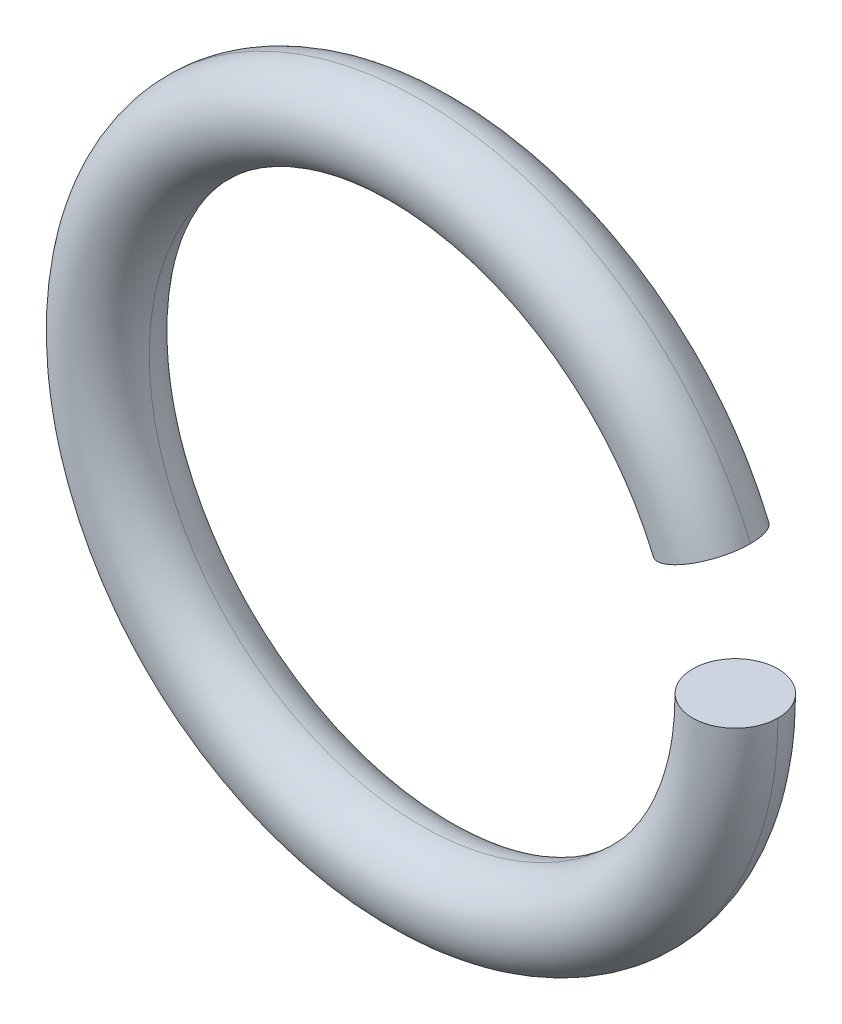
ISO-10303-21;
HEADER;
FILE_DESCRIPTION(('STEP AP214'),'2;1');
FILE_NAME('part.step','',(''),(''),'','','');
FILE_SCHEMA(('AUTOMOTIVE_DESIGN { 1 0 10303 214 1 1 1 1 }'));
ENDSEC;
DATA;
#1=APPLICATION_CONTEXT('core data for automotive mechanical design processes');
#2=APPLICATION_PROTOCOL_DEFINITION('international standard','automotive_design',2000,#1);
#3=PRODUCT_CONTEXT('',#1,'mechanical');
#4=PRODUCT('Part','Part','',(#3));
#5=PRODUCT_RELATED_PRODUCT_CATEGORY('part','',(#4));
#6=PRODUCT_DEFINITION_FORMATION('','',#4);
#7=PRODUCT_DEFINITION_CONTEXT('part definition',#1,'design');
#8=PRODUCT_DEFINITION('design','',#6,#7);
#9=PRODUCT_DEFINITION_SHAPE('','',#8);
#10=(LENGTH_UNIT() NAMED_UNIT(*) SI_UNIT(.MILLI.,.METRE.));
#11=(NAMED_UNIT(*) PLANE_ANGLE_UNIT() SI_UNIT($,.RADIAN.));
#12=(NAMED_UNIT(*) SI_UNIT($,.STERADIAN.) SOLID_ANGLE_UNIT());
#13=UNCERTAINTY_MEASURE_WITH_UNIT(LENGTH_MEASURE(1.E-05),#10,'distance_accuracy_value','');
#14=(GEOMETRIC_REPRESENTATION_CONTEXT(3) GLOBAL_UNCERTAINTY_ASSIGNED_CONTEXT((#13)) GLOBAL_UNIT_ASSIGNED_CONTEXT((#10,
#11,#12)) REPRESENTATION_CONTEXT('',''));
#15=CARTESIAN_POINT('',(0.,0.,0.));
#16=DIRECTION('',(0.,0.,1.));
#17=DIRECTION('',(1.,0.,0.));
#18=AXIS2_PLACEMENT_3D('',#15,#16,#17);
#19=CARTESIAN_POINT('',(0.,0.,0.));
#20=DIRECTION('',(0.,0.,1.));
#21=DIRECTION('',(1.,0.,0.));
#22=AXIS2_PLACEMENT_3D('',#19,#20,#21);
#23=TOROIDAL_SURFACE('',#22,2.95,0.4);
#24=CARTESIAN_POINT('',(2.72316416762785,1.13440597501411,0.));
#25=DIRECTION('',(-0.384544398309868,0.923106497500967,0.));
#26=DIRECTION('',(0.,0.,1.));
#27=AXIS2_PLACEMENT_3D('',#24,#25,#26);
#28=CIRCLE('',#27,0.4);
#29=CARTESIAN_POINT('',(3.09240676662824,1.28822373433806,0.));
#30=VERTEX_POINT('',#29);
#31=CARTESIAN_POINT('',(2.35392156862746,0.980588215690162,0.));
#32=VERTEX_POINT('',#31);
#33=EDGE_CURVE('E63',#30,#32,#28,.T.);
#34=ORIENTED_EDGE('',*,*,#33,.T.);
#35=CARTESIAN_POINT('',(0.,0.,0.));
#36=DIRECTION('',(0.,0.,1.));
#37=DIRECTION('',(-1.,0.,0.));
#38=AXIS2_PLACEMENT_3D('',#35,#36,#37);
#39=CIRCLE('',#38,2.55);
#40=CARTESIAN_POINT('',(2.55,0.,0.));
#41=VERTEX_POINT('',#40);
#42=EDGE_CURVE('E12',#32,#41,#39,.T.);
#43=ORIENTED_EDGE('',*,*,#42,.T.);
#44=CARTESIAN_POINT('',(2.95,0.,0.));
#45=DIRECTION('',(0.,1.,0.));
#46=DIRECTION('',(0.,0.,1.));
#47=AXIS2_PLACEMENT_3D('',#44,#45,#46);
#48=CIRCLE('',#47,0.4);
#49=CARTESIAN_POINT('',(3.35,0.,0.));
#50=VERTEX_POINT('',#49);
#51=EDGE_CURVE('E64',#50,#41,#48,.T.);
#52=ORIENTED_EDGE('',*,*,#51,.F.);
#53=CARTESIAN_POINT('',(0.,0.,0.));
#54=DIRECTION('',(0.,0.,-1.));
#55=DIRECTION('',(1.,0.,0.));
#56=AXIS2_PLACEMENT_3D('',#53,#54,#55);
#57=CIRCLE('',#56,3.35);
#58=EDGE_CURVE('E43',#50,#30,#57,.T.);
#59=ORIENTED_EDGE('',*,*,#58,.T.);
#60=EDGE_LOOP('',(#34,#43,#52,#59));
#61=FACE_BOUND('',#60,.T.);
#62=ADVANCED_FACE('F35',(#61),#23,.T.);
#63=ORIENTED_EDGE('',*,*,#42,.F.);
#64=EDGE_CURVE('E59',#32,#30,#28,.T.);
#65=ORIENTED_EDGE('',*,*,#64,.T.);
#66=ORIENTED_EDGE('',*,*,#58,.F.);
#67=EDGE_CURVE('E69',#41,#50,#48,.T.);
#68=ORIENTED_EDGE('',*,*,#67,.F.);
#69=EDGE_LOOP('',(#63,#65,#66,#68));
#70=FACE_BOUND('',#69,.T.);
#71=ADVANCED_FACE('F37',(#70),#23,.T.);
#72=CARTESIAN_POINT('',(2.72316416762785,1.13440597501411,0.));
#73=DIRECTION('',(-0.384544398309868,0.923106497500967,0.));
#74=DIRECTION('',(0.,0.,1.));
#75=AXIS2_PLACEMENT_3D('',#72,#73,#74);
#76=PLANE('',#75);
#77=ORIENTED_EDGE('',*,*,#33,.F.);
#78=ORIENTED_EDGE('',*,*,#64,.F.);
#79=EDGE_LOOP('',(#77,#78));
#80=FACE_BOUND('',#79,.T.);
#81=ADVANCED_FACE('F67',(#80),#76,.F.);
#82=CARTESIAN_POINT('',(2.95,0.,0.));
#83=DIRECTION('',(0.,1.,0.));
#84=DIRECTION('',(0.,0.,1.));
#85=AXIS2_PLACEMENT_3D('',#82,#83,#84);
#86=PLANE('',#85);
#87=ORIENTED_EDGE('',*,*,#51,.T.);
#88=ORIENTED_EDGE('',*,*,#67,.T.);
#89=EDGE_LOOP('',(#87,#88));
#90=FACE_BOUND('',#89,.T.);
#91=ADVANCED_FACE('F71',(#90),#86,.T.);
#92=CLOSED_SHELL('',(#62,#71,#81,#91));
#93=MANIFOLD_SOLID_BREP('B2',#92);
#94=ADVANCED_BREP_SHAPE_REPRESENTATION('',(#18,#93),#14);
#95=SHAPE_DEFINITION_REPRESENTATION(#9,#94);
ENDSEC;
END-ISO-10303-21;
